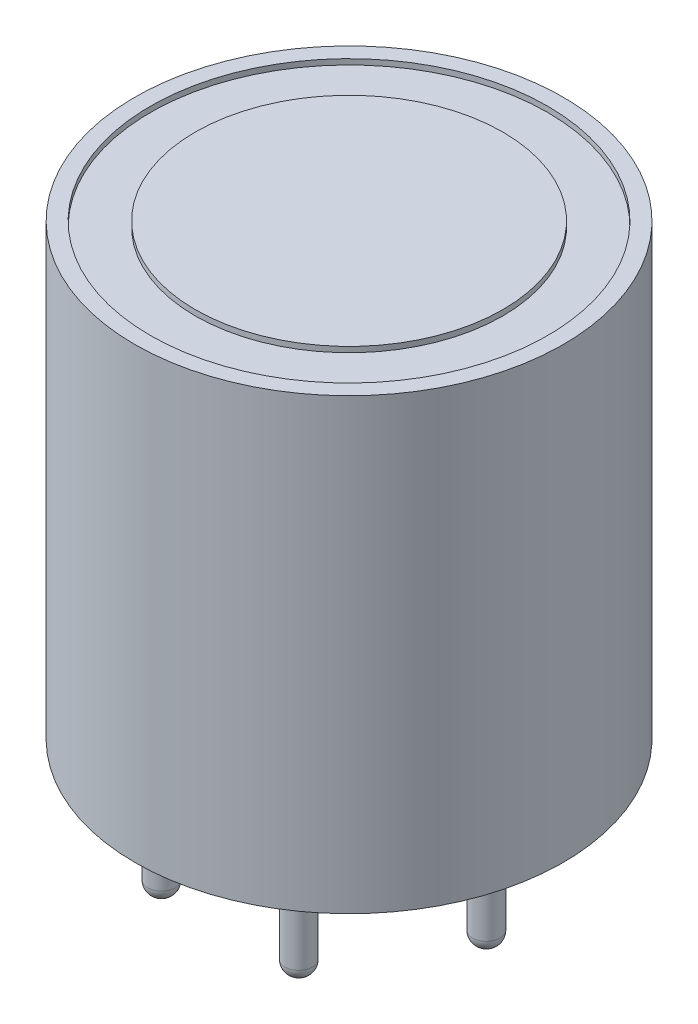
ISO-10303-21;
HEADER;
FILE_DESCRIPTION(('STEP AP214'),'2;1');
FILE_NAME('part.step','',(''),(''),'','','');
FILE_SCHEMA(('AUTOMOTIVE_DESIGN { 1 0 10303 214 1 1 1 1 }'));
ENDSEC;
DATA;
#1=APPLICATION_CONTEXT('core data for automotive mechanical design processes');
#2=APPLICATION_PROTOCOL_DEFINITION('international standard','automotive_design',2000,#1);
#3=PRODUCT_CONTEXT('',#1,'mechanical');
#4=PRODUCT('Part','Part','',(#3));
#5=PRODUCT_RELATED_PRODUCT_CATEGORY('part','',(#4));
#6=PRODUCT_DEFINITION_FORMATION('','',#4);
#7=PRODUCT_DEFINITION_CONTEXT('part definition',#1,'design');
#8=PRODUCT_DEFINITION('design','',#6,#7);
#9=PRODUCT_DEFINITION_SHAPE('','',#8);
#10=(LENGTH_UNIT() NAMED_UNIT(*) SI_UNIT(.MILLI.,.METRE.));
#11=(NAMED_UNIT(*) PLANE_ANGLE_UNIT() SI_UNIT($,.RADIAN.));
#12=(NAMED_UNIT(*) SI_UNIT($,.STERADIAN.) SOLID_ANGLE_UNIT());
#13=UNCERTAINTY_MEASURE_WITH_UNIT(LENGTH_MEASURE(1.E-05),#10,'distance_accuracy_value','');
#14=(GEOMETRIC_REPRESENTATION_CONTEXT(3) GLOBAL_UNCERTAINTY_ASSIGNED_CONTEXT((#13)) GLOBAL_UNIT_ASSIGNED_CONTEXT((#10,
#11,#12)) REPRESENTATION_CONTEXT('',''));
#15=CARTESIAN_POINT('',(0.,0.,0.));
#16=DIRECTION('',(0.,0.,1.));
#17=DIRECTION('',(1.,0.,0.));
#18=AXIS2_PLACEMENT_3D('',#15,#16,#17);
#19=CARTESIAN_POINT('',(0.,24.5,0.));
#20=DIRECTION('',(0.,-1.,0.));
#21=DIRECTION('',(0.,0.,-1.));
#22=AXIS2_PLACEMENT_3D('',#19,#20,#21);
#23=CYLINDRICAL_SURFACE('',#22,11.7);
#24=CARTESIAN_POINT('',(0.,24.5,0.));
#25=DIRECTION('',(0.,1.,0.));
#26=DIRECTION('',(0.,0.,1.));
#27=AXIS2_PLACEMENT_3D('',#24,#25,#26);
#28=CIRCLE('',#27,11.7);
#29=CARTESIAN_POINT('',(0.,24.5,11.7));
#30=VERTEX_POINT('',#29);
#31=EDGE_CURVE('E91',#30,#30,#28,.T.);
#32=ORIENTED_EDGE('',*,*,#31,.F.);
#33=EDGE_LOOP('',(#32));
#34=FACE_BOUND('',#33,.T.);
#35=CARTESIAN_POINT('',(0.,0.,0.));
#36=DIRECTION('',(0.,1.,0.));
#37=DIRECTION('',(0.,0.,1.));
#38=AXIS2_PLACEMENT_3D('',#35,#36,#37);
#39=CIRCLE('',#38,11.7);
#40=CARTESIAN_POINT('',(0.,0.,11.7));
#41=VERTEX_POINT('',#40);
#42=EDGE_CURVE('E92',#41,#41,#39,.T.);
#43=ORIENTED_EDGE('',*,*,#42,.T.);
#44=EDGE_LOOP('',(#43));
#45=FACE_BOUND('',#44,.T.);
#46=ADVANCED_FACE('F38',(#34,#45),#23,.T.);
#47=CARTESIAN_POINT('',(0.,24.5,0.));
#48=DIRECTION('',(0.,1.,0.));
#49=DIRECTION('',(0.,0.,1.));
#50=AXIS2_PLACEMENT_3D('',#47,#48,#49);
#51=PLANE('',#50);
#52=CARTESIAN_POINT('',(0.,24.5,0.));
#53=DIRECTION('',(0.,1.,0.));
#54=DIRECTION('',(0.,0.,1.));
#55=AXIS2_PLACEMENT_3D('',#52,#53,#54);
#56=CIRCLE('',#55,10.85);
#57=CARTESIAN_POINT('',(0.,24.5,10.85));
#58=VERTEX_POINT('',#57);
#59=EDGE_CURVE('E98',#58,#58,#56,.T.);
#60=ORIENTED_EDGE('',*,*,#59,.F.);
#61=EDGE_LOOP('',(#60));
#62=FACE_BOUND('',#61,.T.);
#63=ORIENTED_EDGE('',*,*,#31,.T.);
#64=EDGE_LOOP('',(#63));
#65=FACE_BOUND('',#64,.T.);
#66=ADVANCED_FACE('F131',(#62,#65),#51,.T.);
#67=CARTESIAN_POINT('',(0.,0.,0.));
#68=DIRECTION('',(0.,1.,0.));
#69=DIRECTION('',(0.,0.,1.));
#70=AXIS2_PLACEMENT_3D('',#67,#68,#69);
#71=PLANE('',#70);
#72=CARTESIAN_POINT('',(-3.75000000000003,0.,-6.49519052838327));
#73=DIRECTION('',(0.,1.,0.));
#74=DIRECTION('',(0.,0.,1.));
#75=AXIS2_PLACEMENT_3D('',#72,#73,#74);
#76=CIRCLE('',#75,0.75);
#77=CARTESIAN_POINT('',(-3.75000000000003,0.,-5.74519052838327));
#78=VERTEX_POINT('',#77);
#79=EDGE_CURVE('E76',#78,#78,#76,.F.);
#80=ORIENTED_EDGE('',*,*,#79,.F.);
#81=EDGE_LOOP('',(#80));
#82=FACE_BOUND('',#81,.T.);
#83=CARTESIAN_POINT('',(3.74999999999998,0.,-6.4951905283833));
#84=DIRECTION('',(0.,1.,0.));
#85=DIRECTION('',(0.,0.,1.));
#86=AXIS2_PLACEMENT_3D('',#83,#84,#85);
#87=CIRCLE('',#86,0.750000000000001);
#88=CARTESIAN_POINT('',(3.74999999999998,0.,-5.7451905283833));
#89=VERTEX_POINT('',#88);
#90=EDGE_CURVE('E79',#89,#89,#87,.F.);
#91=ORIENTED_EDGE('',*,*,#90,.F.);
#92=EDGE_LOOP('',(#91));
#93=FACE_BOUND('',#92,.T.);
#94=CARTESIAN_POINT('',(-3.75000000000003,0.,6.49519052838327));
#95=DIRECTION('',(0.,1.,0.));
#96=DIRECTION('',(0.,0.,1.));
#97=AXIS2_PLACEMENT_3D('',#94,#95,#96);
#98=CIRCLE('',#97,0.749999999999999);
#99=CARTESIAN_POINT('',(-3.75000000000003,0.,7.24519052838327));
#100=VERTEX_POINT('',#99);
#101=EDGE_CURVE('E82',#100,#100,#98,.F.);
#102=ORIENTED_EDGE('',*,*,#101,.F.);
#103=EDGE_LOOP('',(#102));
#104=FACE_BOUND('',#103,.T.);
#105=CARTESIAN_POINT('',(3.74999999999998,0.,6.4951905283833));
#106=DIRECTION('',(0.,1.,0.));
#107=DIRECTION('',(0.,0.,1.));
#108=AXIS2_PLACEMENT_3D('',#105,#106,#107);
#109=CIRCLE('',#108,0.75);
#110=CARTESIAN_POINT('',(3.74999999999998,0.,7.2451905283833));
#111=VERTEX_POINT('',#110);
#112=EDGE_CURVE('E85',#111,#111,#109,.F.);
#113=ORIENTED_EDGE('',*,*,#112,.F.);
#114=EDGE_LOOP('',(#113));
#115=FACE_BOUND('',#114,.T.);
#116=CARTESIAN_POINT('',(7.5,0.,0.));
#117=DIRECTION('',(0.,1.,0.));
#118=DIRECTION('',(0.,0.,1.));
#119=AXIS2_PLACEMENT_3D('',#116,#117,#118);
#120=CIRCLE('',#119,0.75);
#121=CARTESIAN_POINT('',(7.5,0.,0.75));
#122=VERTEX_POINT('',#121);
#123=EDGE_CURVE('E88',#122,#122,#120,.F.);
#124=ORIENTED_EDGE('',*,*,#123,.F.);
#125=EDGE_LOOP('',(#124));
#126=FACE_BOUND('',#125,.T.);
#127=ORIENTED_EDGE('',*,*,#42,.F.);
#128=EDGE_LOOP('',(#127));
#129=FACE_BOUND('',#128,.T.);
#130=ADVANCED_FACE('F127',(#82,#93,#104,#115,#126,#129),#71,.F.);
#131=CARTESIAN_POINT('',(0.,24.2,0.));
#132=DIRECTION('',(0.,1.,0.));
#133=DIRECTION('',(0.,0.,1.));
#134=AXIS2_PLACEMENT_3D('',#131,#132,#133);
#135=CYLINDRICAL_SURFACE('',#134,10.85);
#136=CARTESIAN_POINT('',(0.,24.2,0.));
#137=DIRECTION('',(0.,1.,0.));
#138=DIRECTION('',(0.,0.,1.));
#139=AXIS2_PLACEMENT_3D('',#136,#137,#138);
#140=CIRCLE('',#139,10.85);
#141=CARTESIAN_POINT('',(0.,24.2,10.85));
#142=VERTEX_POINT('',#141);
#143=EDGE_CURVE('E95',#142,#142,#140,.T.);
#144=ORIENTED_EDGE('',*,*,#143,.F.);
#145=EDGE_LOOP('',(#144));
#146=FACE_BOUND('',#145,.T.);
#147=ORIENTED_EDGE('',*,*,#59,.T.);
#148=EDGE_LOOP('',(#147));
#149=FACE_BOUND('',#148,.T.);
#150=ADVANCED_FACE('F121',(#146,#149),#135,.F.);
#151=CARTESIAN_POINT('',(0.,24.2,0.));
#152=DIRECTION('',(0.,1.,0.));
#153=DIRECTION('',(0.,0.,1.));
#154=AXIS2_PLACEMENT_3D('',#151,#152,#153);
#155=PLANE('',#154);
#156=CARTESIAN_POINT('',(0.,24.2,0.));
#157=DIRECTION('',(0.,1.,0.));
#158=DIRECTION('',(0.,0.,1.));
#159=AXIS2_PLACEMENT_3D('',#156,#157,#158);
#160=CIRCLE('',#159,8.4);
#161=CARTESIAN_POINT('',(0.,24.2,8.4));
#162=VERTEX_POINT('',#161);
#163=EDGE_CURVE('E104',#162,#162,#160,.T.);
#164=ORIENTED_EDGE('',*,*,#163,.F.);
#165=EDGE_LOOP('',(#164));
#166=FACE_BOUND('',#165,.T.);
#167=ORIENTED_EDGE('',*,*,#143,.T.);
#168=EDGE_LOOP('',(#167));
#169=FACE_BOUND('',#168,.T.);
#170=ADVANCED_FACE('F115',(#166,#169),#155,.T.);
#171=CARTESIAN_POINT('',(0.,24.5,0.));
#172=DIRECTION('',(0.,-1.,0.));
#173=DIRECTION('',(0.,0.,-1.));
#174=AXIS2_PLACEMENT_3D('',#171,#172,#173);
#175=CYLINDRICAL_SURFACE('',#174,8.4);
#176=CARTESIAN_POINT('',(0.,24.5,0.));
#177=DIRECTION('',(0.,1.,0.));
#178=DIRECTION('',(0.,0.,1.));
#179=AXIS2_PLACEMENT_3D('',#176,#177,#178);
#180=CIRCLE('',#179,8.4);
#181=CARTESIAN_POINT('',(0.,24.5,8.4));
#182=VERTEX_POINT('',#181);
#183=EDGE_CURVE('E101',#182,#182,#180,.T.);
#184=ORIENTED_EDGE('',*,*,#183,.F.);
#185=EDGE_LOOP('',(#184));
#186=FACE_BOUND('',#185,.T.);
#187=ORIENTED_EDGE('',*,*,#163,.T.);
#188=EDGE_LOOP('',(#187));
#189=FACE_BOUND('',#188,.T.);
#190=ADVANCED_FACE('F112',(#186,#189),#175,.T.);
#191=CARTESIAN_POINT('',(0.,24.5,0.));
#192=DIRECTION('',(0.,1.,0.));
#193=DIRECTION('',(0.,0.,1.));
#194=AXIS2_PLACEMENT_3D('',#191,#192,#193);
#195=PLANE('',#194);
#196=ORIENTED_EDGE('',*,*,#183,.T.);
#197=EDGE_LOOP('',(#196));
#198=FACE_BOUND('',#197,.T.);
#199=ADVANCED_FACE('F110',(#198),#195,.T.);
#200=CARTESIAN_POINT('',(7.5,-6.,0.));
#201=DIRECTION('',(0.,1.,0.));
#202=DIRECTION('',(0.,0.,1.));
#203=AXIS2_PLACEMENT_3D('',#200,#201,#202);
#204=CYLINDRICAL_SURFACE('',#203,0.75);
#205=CARTESIAN_POINT('',(7.5,-5.3,0.));
#206=DIRECTION('',(0.,-1.,0.));
#207=DIRECTION('',(0.,0.,-1.));
#208=AXIS2_PLACEMENT_3D('',#205,#206,#207);
#209=CIRCLE('',#208,0.75);
#210=CARTESIAN_POINT('',(7.5,-5.3,-0.75));
#211=VERTEX_POINT('',#210);
#212=EDGE_CURVE('E10',#211,#211,#209,.F.);
#213=ORIENTED_EDGE('',*,*,#212,.T.);
#214=EDGE_LOOP('',(#213));
#215=FACE_BOUND('',#214,.T.);
#216=ORIENTED_EDGE('',*,*,#123,.T.);
#217=EDGE_LOOP('',(#216));
#218=FACE_BOUND('',#217,.T.);
#219=ADVANCED_FACE('F192',(#215,#218),#204,.T.);
#220=CARTESIAN_POINT('',(7.5,-6.,0.));
#221=DIRECTION('',(0.,-1.,0.));
#222=DIRECTION('',(0.,0.,-1.));
#223=AXIS2_PLACEMENT_3D('',#220,#221,#222);
#224=PLANE('',#223);
#225=CARTESIAN_POINT('',(7.5,-6.,0.));
#226=DIRECTION('',(0.,-1.,0.));
#227=DIRECTION('',(0.,0.,-1.));
#228=AXIS2_PLACEMENT_3D('',#225,#226,#227);
#229=CIRCLE('',#228,0.0500000000000003);
#230=CARTESIAN_POINT('',(7.5,-6.,-0.0500000000000003));
#231=VERTEX_POINT('',#230);
#232=EDGE_CURVE('E45',#231,#231,#229,.T.);
#233=ORIENTED_EDGE('',*,*,#232,.T.);
#234=EDGE_LOOP('',(#233));
#235=FACE_BOUND('',#234,.T.);
#236=ADVANCED_FACE('F185',(#235),#224,.T.);
#237=CARTESIAN_POINT('',(3.74999999999998,-6.,6.4951905283833));
#238=DIRECTION('',(0.,1.,0.));
#239=DIRECTION('',(0.,0.,1.));
#240=AXIS2_PLACEMENT_3D('',#237,#238,#239);
#241=CYLINDRICAL_SURFACE('',#240,0.75);
#242=CARTESIAN_POINT('',(3.74999999999998,-5.3,6.4951905283833));
#243=DIRECTION('',(0.,-1.,0.));
#244=DIRECTION('',(0.,0.,-1.));
#245=AXIS2_PLACEMENT_3D('',#242,#243,#244);
#246=CIRCLE('',#245,0.75);
#247=CARTESIAN_POINT('',(3.74999999999998,-5.3,5.7451905283833));
#248=VERTEX_POINT('',#247);
#249=EDGE_CURVE('E49',#248,#248,#246,.F.);
#250=ORIENTED_EDGE('',*,*,#249,.T.);
#251=EDGE_LOOP('',(#250));
#252=FACE_BOUND('',#251,.T.);
#253=ORIENTED_EDGE('',*,*,#112,.T.);
#254=EDGE_LOOP('',(#253));
#255=FACE_BOUND('',#254,.T.);
#256=ADVANCED_FACE('F176',(#252,#255),#241,.T.);
#257=CARTESIAN_POINT('',(3.74999999999998,-6.,6.4951905283833));
#258=DIRECTION('',(0.,-1.,0.));
#259=DIRECTION('',(0.,0.,-1.));
#260=AXIS2_PLACEMENT_3D('',#257,#258,#259);
#261=PLANE('',#260);
#262=CARTESIAN_POINT('',(3.74999999999998,-6.,6.4951905283833));
#263=DIRECTION('',(0.,-1.,0.));
#264=DIRECTION('',(0.,0.,-1.));
#265=AXIS2_PLACEMENT_3D('',#262,#263,#264);
#266=CIRCLE('',#265,0.0500000000000001);
#267=CARTESIAN_POINT('',(3.74999999999998,-6.,6.4451905283833));
#268=VERTEX_POINT('',#267);
#269=EDGE_CURVE('E53',#268,#268,#266,.T.);
#270=ORIENTED_EDGE('',*,*,#269,.T.);
#271=EDGE_LOOP('',(#270));
#272=FACE_BOUND('',#271,.T.);
#273=ADVANCED_FACE('F173',(#272),#261,.T.);
#274=CARTESIAN_POINT('',(-3.75000000000003,-6.,6.49519052838327));
#275=DIRECTION('',(0.,1.,0.));
#276=DIRECTION('',(0.,0.,1.));
#277=AXIS2_PLACEMENT_3D('',#274,#275,#276);
#278=CYLINDRICAL_SURFACE('',#277,0.749999999999999);
#279=CARTESIAN_POINT('',(-3.75000000000003,-5.3,6.49519052838327));
#280=DIRECTION('',(0.,-1.,0.));
#281=DIRECTION('',(0.,0.,-1.));
#282=AXIS2_PLACEMENT_3D('',#279,#280,#281);
#283=CIRCLE('',#282,0.749999999999999);
#284=CARTESIAN_POINT('',(-3.75000000000003,-5.3,5.74519052838327));
#285=VERTEX_POINT('',#284);
#286=EDGE_CURVE('E70',#285,#285,#283,.F.);
#287=ORIENTED_EDGE('',*,*,#286,.T.);
#288=EDGE_LOOP('',(#287));
#289=FACE_BOUND('',#288,.T.);
#290=ORIENTED_EDGE('',*,*,#101,.T.);
#291=EDGE_LOOP('',(#290));
#292=FACE_BOUND('',#291,.T.);
#293=ADVANCED_FACE('F175',(#289,#292),#278,.T.);
#294=CARTESIAN_POINT('',(-3.75000000000003,-6.,6.49519052838327));
#295=DIRECTION('',(0.,-1.,0.));
#296=DIRECTION('',(0.,0.,-1.));
#297=AXIS2_PLACEMENT_3D('',#294,#295,#296);
#298=PLANE('',#297);
#299=CARTESIAN_POINT('',(-3.75000000000003,-6.,6.49519052838327));
#300=DIRECTION('',(0.,-1.,0.));
#301=DIRECTION('',(0.,0.,-1.));
#302=AXIS2_PLACEMENT_3D('',#299,#300,#301);
#303=CIRCLE('',#302,0.0499999999999987);
#304=CARTESIAN_POINT('',(-3.75000000000003,-6.,6.44519052838327));
#305=VERTEX_POINT('',#304);
#306=EDGE_CURVE('E73',#305,#305,#303,.T.);
#307=ORIENTED_EDGE('',*,*,#306,.T.);
#308=EDGE_LOOP('',(#307));
#309=FACE_BOUND('',#308,.T.);
#310=ADVANCED_FACE('F182',(#309),#298,.T.);
#311=CARTESIAN_POINT('',(3.74999999999998,-6.,-6.4951905283833));
#312=DIRECTION('',(0.,1.,0.));
#313=DIRECTION('',(0.,0.,1.));
#314=AXIS2_PLACEMENT_3D('',#311,#312,#313);
#315=CYLINDRICAL_SURFACE('',#314,0.750000000000001);
#316=CARTESIAN_POINT('',(3.74999999999998,-5.3,-6.4951905283833));
#317=DIRECTION('',(0.,-1.,0.));
#318=DIRECTION('',(0.,0.,-1.));
#319=AXIS2_PLACEMENT_3D('',#316,#317,#318);
#320=CIRCLE('',#319,0.750000000000001);
#321=CARTESIAN_POINT('',(3.74999999999998,-5.3,-7.2451905283833));
#322=VERTEX_POINT('',#321);
#323=EDGE_CURVE('E58',#322,#322,#320,.F.);
#324=ORIENTED_EDGE('',*,*,#323,.T.);
#325=EDGE_LOOP('',(#324));
#326=FACE_BOUND('',#325,.T.);
#327=ORIENTED_EDGE('',*,*,#90,.T.);
#328=EDGE_LOOP('',(#327));
#329=FACE_BOUND('',#328,.T.);
#330=ADVANCED_FACE('F231',(#326,#329),#315,.T.);
#331=CARTESIAN_POINT('',(3.74999999999998,-6.,-6.4951905283833));
#332=DIRECTION('',(0.,-1.,0.));
#333=DIRECTION('',(0.,0.,-1.));
#334=AXIS2_PLACEMENT_3D('',#331,#332,#333);
#335=PLANE('',#334);
#336=CARTESIAN_POINT('',(3.74999999999998,-6.,-6.4951905283833));
#337=DIRECTION('',(0.,-1.,0.));
#338=DIRECTION('',(0.,0.,-1.));
#339=AXIS2_PLACEMENT_3D('',#336,#337,#338);
#340=CIRCLE('',#339,0.0500000000000008);
#341=CARTESIAN_POINT('',(3.74999999999998,-6.,-6.5451905283833));
#342=VERTEX_POINT('',#341);
#343=EDGE_CURVE('E61',#342,#342,#340,.T.);
#344=ORIENTED_EDGE('',*,*,#343,.T.);
#345=EDGE_LOOP('',(#344));
#346=FACE_BOUND('',#345,.T.);
#347=ADVANCED_FACE('F240',(#346),#335,.T.);
#348=CARTESIAN_POINT('',(-3.75000000000003,-6.,-6.49519052838327));
#349=DIRECTION('',(0.,1.,0.));
#350=DIRECTION('',(0.,0.,1.));
#351=AXIS2_PLACEMENT_3D('',#348,#349,#350);
#352=CYLINDRICAL_SURFACE('',#351,0.75);
#353=CARTESIAN_POINT('',(-3.75000000000003,-5.3,-6.49519052838327));
#354=DIRECTION('',(0.,-1.,0.));
#355=DIRECTION('',(0.,0.,-1.));
#356=AXIS2_PLACEMENT_3D('',#353,#354,#355);
#357=CIRCLE('',#356,0.75);
#358=CARTESIAN_POINT('',(-3.75000000000003,-5.3,-7.24519052838327));
#359=VERTEX_POINT('',#358);
#360=EDGE_CURVE('E64',#359,#359,#357,.F.);
#361=ORIENTED_EDGE('',*,*,#360,.T.);
#362=EDGE_LOOP('',(#361));
#363=FACE_BOUND('',#362,.T.);
#364=ORIENTED_EDGE('',*,*,#79,.T.);
#365=EDGE_LOOP('',(#364));
#366=FACE_BOUND('',#365,.T.);
#367=ADVANCED_FACE('F250',(#363,#366),#352,.T.);
#368=CARTESIAN_POINT('',(-3.75000000000003,-6.,-6.49519052838327));
#369=DIRECTION('',(0.,-1.,0.));
#370=DIRECTION('',(0.,0.,-1.));
#371=AXIS2_PLACEMENT_3D('',#368,#369,#370);
#372=PLANE('',#371);
#373=CARTESIAN_POINT('',(-3.75000000000003,-6.,-6.49519052838327));
#374=DIRECTION('',(0.,-1.,0.));
#375=DIRECTION('',(0.,0.,-1.));
#376=AXIS2_PLACEMENT_3D('',#373,#374,#375);
#377=CIRCLE('',#376,0.0500000000000005);
#378=CARTESIAN_POINT('',(-3.75000000000003,-6.,-6.54519052838327));
#379=VERTEX_POINT('',#378);
#380=EDGE_CURVE('E67',#379,#379,#377,.T.);
#381=ORIENTED_EDGE('',*,*,#380,.T.);
#382=EDGE_LOOP('',(#381));
#383=FACE_BOUND('',#382,.T.);
#384=ADVANCED_FACE('F154',(#383),#372,.T.);
#385=CARTESIAN_POINT('',(-3.75000000000003,-5.3,6.49519052838327));
#386=DIRECTION('',(0.,-1.,0.));
#387=DIRECTION('',(0.,0.,-1.));
#388=AXIS2_PLACEMENT_3D('',#385,#386,#387);
#389=DEGENERATE_TOROIDAL_SURFACE('',#388,0.0499999999999987,0.7,.T.);
#390=ORIENTED_EDGE('',*,*,#286,.F.);
#391=EDGE_LOOP('',(#390));
#392=FACE_BOUND('',#391,.T.);
#393=ORIENTED_EDGE('',*,*,#306,.F.);
#394=EDGE_LOOP('',(#393));
#395=FACE_BOUND('',#394,.T.);
#396=ADVANCED_FACE('F150',(#392,#395),#389,.T.);
#397=CARTESIAN_POINT('',(-3.75000000000003,-5.3,-6.49519052838327));
#398=DIRECTION('',(0.,-1.,0.));
#399=DIRECTION('',(0.,0.,-1.));
#400=AXIS2_PLACEMENT_3D('',#397,#398,#399);
#401=DEGENERATE_TOROIDAL_SURFACE('',#400,0.0500000000000005,0.7,.T.);
#402=ORIENTED_EDGE('',*,*,#360,.F.);
#403=EDGE_LOOP('',(#402));
#404=FACE_BOUND('',#403,.T.);
#405=ORIENTED_EDGE('',*,*,#380,.F.);
#406=EDGE_LOOP('',(#405));
#407=FACE_BOUND('',#406,.T.);
#408=ADVANCED_FACE('F153',(#404,#407),#401,.T.);
#409=CARTESIAN_POINT('',(3.74999999999998,-5.3,-6.4951905283833));
#410=DIRECTION('',(0.,-1.,0.));
#411=DIRECTION('',(0.,0.,-1.));
#412=AXIS2_PLACEMENT_3D('',#409,#410,#411);
#413=DEGENERATE_TOROIDAL_SURFACE('',#412,0.0500000000000008,0.7,.T.);
#414=ORIENTED_EDGE('',*,*,#323,.F.);
#415=EDGE_LOOP('',(#414));
#416=FACE_BOUND('',#415,.T.);
#417=ORIENTED_EDGE('',*,*,#343,.F.);
#418=EDGE_LOOP('',(#417));
#419=FACE_BOUND('',#418,.T.);
#420=ADVANCED_FACE('F158',(#416,#419),#413,.T.);
#421=CARTESIAN_POINT('',(3.74999999999998,-5.3,6.4951905283833));
#422=DIRECTION('',(0.,-1.,0.));
#423=DIRECTION('',(0.,0.,-1.));
#424=AXIS2_PLACEMENT_3D('',#421,#422,#423);
#425=DEGENERATE_TOROIDAL_SURFACE('',#424,0.0500000000000001,0.7,.T.);
#426=ORIENTED_EDGE('',*,*,#249,.F.);
#427=EDGE_LOOP('',(#426));
#428=FACE_BOUND('',#427,.T.);
#429=ORIENTED_EDGE('',*,*,#269,.F.);
#430=EDGE_LOOP('',(#429));
#431=FACE_BOUND('',#430,.T.);
#432=ADVANCED_FACE('F161',(#428,#431),#425,.T.);
#433=CARTESIAN_POINT('',(7.5,-5.3,0.));
#434=DIRECTION('',(0.,-1.,0.));
#435=DIRECTION('',(0.,0.,-1.));
#436=AXIS2_PLACEMENT_3D('',#433,#434,#435);
#437=DEGENERATE_TOROIDAL_SURFACE('',#436,0.0500000000000003,0.7,.T.);
#438=ORIENTED_EDGE('',*,*,#212,.F.);
#439=EDGE_LOOP('',(#438));
#440=FACE_BOUND('',#439,.T.);
#441=ORIENTED_EDGE('',*,*,#232,.F.);
#442=EDGE_LOOP('',(#441));
#443=FACE_BOUND('',#442,.T.);
#444=ADVANCED_FACE('F40',(#440,#443),#437,.T.);
#445=CLOSED_SHELL('',(#46,#66,#130,#150,#170,#190,#199,#219,#236,#256,#273,#293,#310,#330,#347,
#367,#384,#396,#408,#420,#432,#444));
#446=MANIFOLD_SOLID_BREP('B2',#445);
#447=ADVANCED_BREP_SHAPE_REPRESENTATION('',(#18,#446),#14);
#448=SHAPE_DEFINITION_REPRESENTATION(#9,#447);
ENDSEC;
END-ISO-10303-21;
